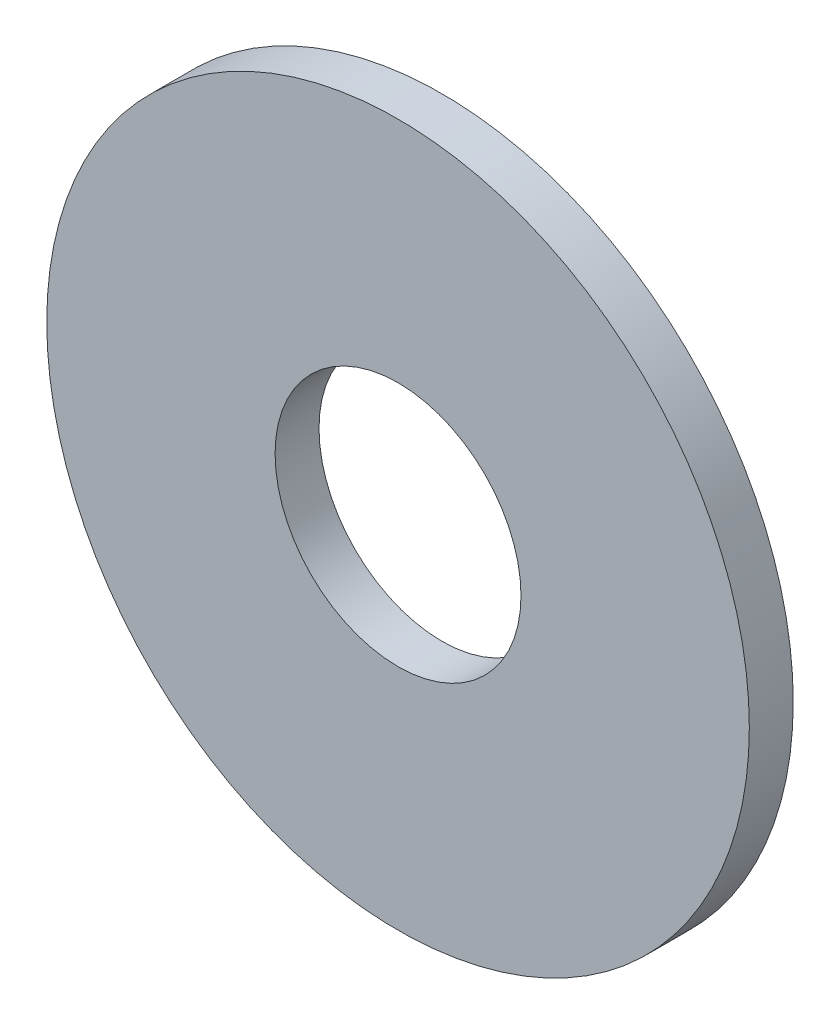
ISO-10303-21;
HEADER;
FILE_DESCRIPTION(('STEP AP214'),'2;1');
FILE_NAME('part.step','',(''),(''),'','','');
FILE_SCHEMA(('AUTOMOTIVE_DESIGN { 1 0 10303 214 1 1 1 1 }'));
ENDSEC;
DATA;
#1=APPLICATION_CONTEXT('core data for automotive mechanical design processes');
#2=APPLICATION_PROTOCOL_DEFINITION('international standard','automotive_design',2000,#1);
#3=PRODUCT_CONTEXT('',#1,'mechanical');
#4=PRODUCT('Part','Part','',(#3));
#5=PRODUCT_RELATED_PRODUCT_CATEGORY('part','',(#4));
#6=PRODUCT_DEFINITION_FORMATION('','',#4);
#7=PRODUCT_DEFINITION_CONTEXT('part definition',#1,'design');
#8=PRODUCT_DEFINITION('design','',#6,#7);
#9=PRODUCT_DEFINITION_SHAPE('','',#8);
#10=(LENGTH_UNIT() NAMED_UNIT(*) SI_UNIT(.MILLI.,.METRE.));
#11=(NAMED_UNIT(*) PLANE_ANGLE_UNIT() SI_UNIT($,.RADIAN.));
#12=(NAMED_UNIT(*) SI_UNIT($,.STERADIAN.) SOLID_ANGLE_UNIT());
#13=UNCERTAINTY_MEASURE_WITH_UNIT(LENGTH_MEASURE(1.E-05),#10,'distance_accuracy_value','');
#14=(GEOMETRIC_REPRESENTATION_CONTEXT(3) GLOBAL_UNCERTAINTY_ASSIGNED_CONTEXT((#13)) GLOBAL_UNIT_ASSIGNED_CONTEXT((#10,
#11,#12)) REPRESENTATION_CONTEXT('',''));
#15=CARTESIAN_POINT('',(0.,0.,0.));
#16=DIRECTION('',(0.,0.,1.));
#17=DIRECTION('',(1.,0.,0.));
#18=AXIS2_PLACEMENT_3D('',#15,#16,#17);
#19=CARTESIAN_POINT('',(0.,0.,1.5));
#20=DIRECTION('',(0.,0.,-1.));
#21=DIRECTION('',(-1.,0.,0.));
#22=AXIS2_PLACEMENT_3D('',#19,#20,#21);
#23=CYLINDRICAL_SURFACE('',#22,12.);
#24=CARTESIAN_POINT('',(0.,0.,1.5));
#25=DIRECTION('',(0.,0.,1.));
#26=DIRECTION('',(1.,0.,0.));
#27=AXIS2_PLACEMENT_3D('',#24,#25,#26);
#28=CIRCLE('',#27,12.);
#29=CARTESIAN_POINT('',(12.,0.,1.5));
#30=VERTEX_POINT('',#29);
#31=EDGE_CURVE('E10',#30,#30,#28,.T.);
#32=ORIENTED_EDGE('',*,*,#31,.F.);
#33=EDGE_LOOP('',(#32));
#34=FACE_BOUND('',#33,.T.);
#35=CARTESIAN_POINT('',(0.,0.,0.));
#36=DIRECTION('',(0.,0.,1.));
#37=DIRECTION('',(1.,0.,0.));
#38=AXIS2_PLACEMENT_3D('',#35,#36,#37);
#39=CIRCLE('',#38,12.);
#40=CARTESIAN_POINT('',(12.,0.,0.));
#41=VERTEX_POINT('',#40);
#42=EDGE_CURVE('E38',#41,#41,#39,.T.);
#43=ORIENTED_EDGE('',*,*,#42,.T.);
#44=EDGE_LOOP('',(#43));
#45=FACE_BOUND('',#44,.T.);
#46=ADVANCED_FACE('F35',(#34,#45),#23,.T.);
#47=CARTESIAN_POINT('',(0.,0.,1.5));
#48=DIRECTION('',(0.,0.,1.));
#49=DIRECTION('',(1.,0.,0.));
#50=AXIS2_PLACEMENT_3D('',#47,#48,#49);
#51=PLANE('',#50);
#52=CARTESIAN_POINT('',(0.,0.,1.5));
#53=DIRECTION('',(0.,0.,1.));
#54=DIRECTION('',(1.,0.,0.));
#55=AXIS2_PLACEMENT_3D('',#52,#53,#54);
#56=CIRCLE('',#55,4.2);
#57=CARTESIAN_POINT('',(4.2,0.,1.5));
#58=VERTEX_POINT('',#57);
#59=EDGE_CURVE('E47',#58,#58,#56,.T.);
#60=ORIENTED_EDGE('',*,*,#59,.F.);
#61=EDGE_LOOP('',(#60));
#62=FACE_BOUND('',#61,.T.);
#63=ORIENTED_EDGE('',*,*,#31,.T.);
#64=EDGE_LOOP('',(#63));
#65=FACE_BOUND('',#64,.T.);
#66=ADVANCED_FACE('F62',(#62,#65),#51,.T.);
#67=CARTESIAN_POINT('',(0.,0.,0.));
#68=DIRECTION('',(0.,0.,1.));
#69=DIRECTION('',(1.,0.,0.));
#70=AXIS2_PLACEMENT_3D('',#67,#68,#69);
#71=PLANE('',#70);
#72=CARTESIAN_POINT('',(0.,0.,0.));
#73=DIRECTION('',(0.,0.,1.));
#74=DIRECTION('',(1.,0.,0.));
#75=AXIS2_PLACEMENT_3D('',#72,#73,#74);
#76=CIRCLE('',#75,4.2);
#77=CARTESIAN_POINT('',(4.2,0.,0.));
#78=VERTEX_POINT('',#77);
#79=EDGE_CURVE('E45',#78,#78,#76,.T.);
#80=ORIENTED_EDGE('',*,*,#79,.T.);
#81=EDGE_LOOP('',(#80));
#82=FACE_BOUND('',#81,.T.);
#83=ORIENTED_EDGE('',*,*,#42,.F.);
#84=EDGE_LOOP('',(#83));
#85=FACE_BOUND('',#84,.T.);
#86=ADVANCED_FACE('F53',(#82,#85),#71,.F.);
#87=CARTESIAN_POINT('',(0.,0.,0.));
#88=DIRECTION('',(0.,0.,1.));
#89=DIRECTION('',(1.,0.,0.));
#90=AXIS2_PLACEMENT_3D('',#87,#88,#89);
#91=CYLINDRICAL_SURFACE('',#90,4.2);
#92=ORIENTED_EDGE('',*,*,#79,.F.);
#93=EDGE_LOOP('',(#92));
#94=FACE_BOUND('',#93,.T.);
#95=ORIENTED_EDGE('',*,*,#59,.T.);
#96=EDGE_LOOP('',(#95));
#97=FACE_BOUND('',#96,.T.);
#98=ADVANCED_FACE('F56',(#94,#97),#91,.F.);
#99=CLOSED_SHELL('',(#46,#66,#86,#98));
#100=MANIFOLD_SOLID_BREP('B2',#99);
#101=ADVANCED_BREP_SHAPE_REPRESENTATION('',(#18,#100),#14);
#102=SHAPE_DEFINITION_REPRESENTATION(#9,#101);
ENDSEC;
END-ISO-10303-21;
